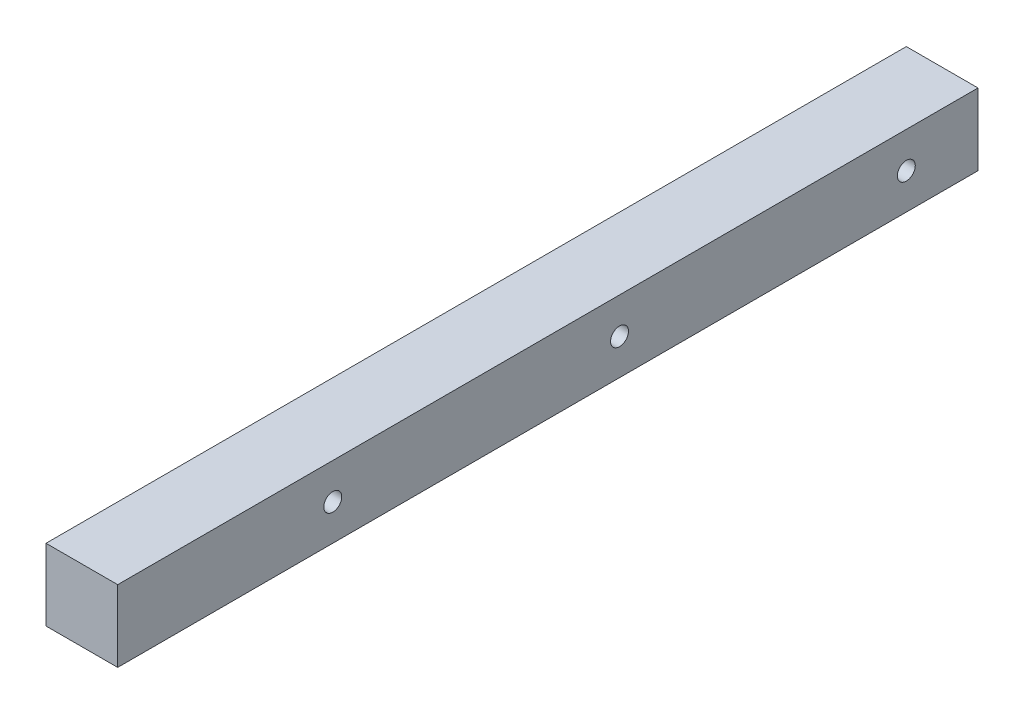
ISO-10303-21;
HEADER;
FILE_DESCRIPTION(('STEP AP214'),'2;1');
FILE_NAME('part.step','',(''),(''),'','','');
FILE_SCHEMA(('AUTOMOTIVE_DESIGN { 1 0 10303 214 1 1 1 1 }'));
ENDSEC;
DATA;
#1=APPLICATION_CONTEXT('core data for automotive mechanical design processes');
#2=APPLICATION_PROTOCOL_DEFINITION('international standard','automotive_design',2000,#1);
#3=PRODUCT_CONTEXT('',#1,'mechanical');
#4=PRODUCT('Part','Part','',(#3));
#5=PRODUCT_RELATED_PRODUCT_CATEGORY('part','',(#4));
#6=PRODUCT_DEFINITION_FORMATION('','',#4);
#7=PRODUCT_DEFINITION_CONTEXT('part definition',#1,'design');
#8=PRODUCT_DEFINITION('design','',#6,#7);
#9=PRODUCT_DEFINITION_SHAPE('','',#8);
#10=(LENGTH_UNIT() NAMED_UNIT(*) SI_UNIT(.MILLI.,.METRE.));
#11=(NAMED_UNIT(*) PLANE_ANGLE_UNIT() SI_UNIT($,.RADIAN.));
#12=(NAMED_UNIT(*) SI_UNIT($,.STERADIAN.) SOLID_ANGLE_UNIT());
#13=UNCERTAINTY_MEASURE_WITH_UNIT(LENGTH_MEASURE(1.E-05),#10,'distance_accuracy_value','');
#14=(GEOMETRIC_REPRESENTATION_CONTEXT(3) GLOBAL_UNCERTAINTY_ASSIGNED_CONTEXT((#13)) GLOBAL_UNIT_ASSIGNED_CONTEXT((#10,
#11,#12)) REPRESENTATION_CONTEXT('',''));
#15=CARTESIAN_POINT('',(0.,0.,0.));
#16=DIRECTION('',(0.,0.,1.));
#17=DIRECTION('',(1.,0.,0.));
#18=AXIS2_PLACEMENT_3D('',#15,#16,#17);
#19=CARTESIAN_POINT('',(12.7,-12.7,152.4));
#20=DIRECTION('',(-1.,0.,0.));
#21=DIRECTION('',(0.,0.,1.));
#22=AXIS2_PLACEMENT_3D('',#19,#20,#21);
#23=PLANE('',#22);
#24=CARTESIAN_POINT('',(12.7,0.,-127.));
#25=DIRECTION('',(-1.,0.,0.));
#26=DIRECTION('',(0.,0.,1.));
#27=AXIS2_PLACEMENT_3D('',#24,#25,#26);
#28=CIRCLE('',#27,3.175);
#29=CARTESIAN_POINT('',(12.7,0.,-123.825));
#30=VERTEX_POINT('',#29);
#31=EDGE_CURVE('E121',#30,#30,#28,.T.);
#32=ORIENTED_EDGE('',*,*,#31,.T.);
#33=EDGE_LOOP('',(#32));
#34=FACE_BOUND('',#33,.T.);
#35=CARTESIAN_POINT('',(12.7,0.,76.2));
#36=DIRECTION('',(-1.,0.,0.));
#37=DIRECTION('',(0.,0.,1.));
#38=AXIS2_PLACEMENT_3D('',#35,#36,#37);
#39=CIRCLE('',#38,3.175);
#40=CARTESIAN_POINT('',(12.7,0.,79.375));
#41=VERTEX_POINT('',#40);
#42=EDGE_CURVE('E124',#41,#41,#39,.T.);
#43=ORIENTED_EDGE('',*,*,#42,.T.);
#44=EDGE_LOOP('',(#43));
#45=FACE_BOUND('',#44,.T.);
#46=CARTESIAN_POINT('',(12.7,0.,-25.4));
#47=DIRECTION('',(-1.,0.,0.));
#48=DIRECTION('',(0.,0.,1.));
#49=AXIS2_PLACEMENT_3D('',#46,#47,#48);
#50=CIRCLE('',#49,3.175);
#51=CARTESIAN_POINT('',(12.7,0.,-22.225));
#52=VERTEX_POINT('',#51);
#53=EDGE_CURVE('E118',#52,#52,#50,.T.);
#54=ORIENTED_EDGE('',*,*,#53,.T.);
#55=EDGE_LOOP('',(#54));
#56=FACE_BOUND('',#55,.T.);
#57=DIRECTION('',(0.,1.,0.));
#58=VECTOR('',#57,1.);
#59=CARTESIAN_POINT('',(12.7,-12.7,-152.4));
#60=LINE('',#59,#58);
#61=CARTESIAN_POINT('',(12.7,-12.7,-152.4));
#62=VERTEX_POINT('',#61);
#63=CARTESIAN_POINT('',(12.7,12.7,-152.4));
#64=VERTEX_POINT('',#63);
#65=EDGE_CURVE('E104',#62,#64,#60,.T.);
#66=ORIENTED_EDGE('',*,*,#65,.T.);
#67=DIRECTION('',(0.,0.,-1.));
#68=VECTOR('',#67,1.);
#69=CARTESIAN_POINT('',(12.7,12.7,152.4));
#70=LINE('',#69,#68);
#71=CARTESIAN_POINT('',(12.7,12.7,152.4));
#72=VERTEX_POINT('',#71);
#73=EDGE_CURVE('E11',#72,#64,#70,.T.);
#74=ORIENTED_EDGE('',*,*,#73,.F.);
#75=DIRECTION('',(0.,1.,0.));
#76=VECTOR('',#75,1.);
#77=CARTESIAN_POINT('',(12.7,-12.7,152.4));
#78=LINE('',#77,#76);
#79=CARTESIAN_POINT('',(12.7,-12.7,152.4));
#80=VERTEX_POINT('',#79);
#81=EDGE_CURVE('E92',#80,#72,#78,.T.);
#82=ORIENTED_EDGE('',*,*,#81,.F.);
#83=DIRECTION('',(0.,0.,-1.));
#84=VECTOR('',#83,1.);
#85=CARTESIAN_POINT('',(12.7,-12.7,152.4));
#86=LINE('',#85,#84);
#87=EDGE_CURVE('E100',#80,#62,#86,.T.);
#88=ORIENTED_EDGE('',*,*,#87,.T.);
#89=EDGE_LOOP('',(#66,#74,#82,#88));
#90=FACE_BOUND('',#89,.T.);
#91=ADVANCED_FACE('F41',(#34,#45,#56,#90),#23,.F.);
#92=CARTESIAN_POINT('',(-12.7,12.7,152.4));
#93=DIRECTION('',(0.,-1.,0.));
#94=DIRECTION('',(0.,0.,-1.));
#95=AXIS2_PLACEMENT_3D('',#92,#93,#94);
#96=PLANE('',#95);
#97=DIRECTION('',(-1.,0.,0.));
#98=VECTOR('',#97,1.);
#99=CARTESIAN_POINT('',(-12.7,12.7,-152.4));
#100=LINE('',#99,#98);
#101=CARTESIAN_POINT('',(-12.7,12.7,-152.4));
#102=VERTEX_POINT('',#101);
#103=EDGE_CURVE('E96',#64,#102,#100,.T.);
#104=ORIENTED_EDGE('',*,*,#103,.T.);
#105=DIRECTION('',(0.,0.,-1.));
#106=VECTOR('',#105,1.);
#107=CARTESIAN_POINT('',(-12.7,12.7,152.4));
#108=LINE('',#107,#106);
#109=CARTESIAN_POINT('',(-12.7,12.7,152.4));
#110=VERTEX_POINT('',#109);
#111=EDGE_CURVE('E49',#110,#102,#108,.T.);
#112=ORIENTED_EDGE('',*,*,#111,.F.);
#113=DIRECTION('',(-1.,0.,0.));
#114=VECTOR('',#113,1.);
#115=CARTESIAN_POINT('',(-12.7,12.7,152.4));
#116=LINE('',#115,#114);
#117=EDGE_CURVE('E87',#72,#110,#116,.T.);
#118=ORIENTED_EDGE('',*,*,#117,.F.);
#119=ORIENTED_EDGE('',*,*,#73,.T.);
#120=EDGE_LOOP('',(#104,#112,#118,#119));
#121=FACE_BOUND('',#120,.T.);
#122=ADVANCED_FACE('F95',(#121),#96,.F.);
#123=CARTESIAN_POINT('',(-12.7,-12.7,152.4));
#124=DIRECTION('',(1.,0.,0.));
#125=DIRECTION('',(0.,0.,-1.));
#126=AXIS2_PLACEMENT_3D('',#123,#124,#125);
#127=PLANE('',#126);
#128=CARTESIAN_POINT('',(-12.7,0.,-127.));
#129=DIRECTION('',(-1.,0.,0.));
#130=DIRECTION('',(0.,0.,1.));
#131=AXIS2_PLACEMENT_3D('',#128,#129,#130);
#132=CIRCLE('',#131,3.175);
#133=CARTESIAN_POINT('',(-12.7,0.,-123.825));
#134=VERTEX_POINT('',#133);
#135=EDGE_CURVE('E127',#134,#134,#132,.T.);
#136=ORIENTED_EDGE('',*,*,#135,.F.);
#137=EDGE_LOOP('',(#136));
#138=FACE_BOUND('',#137,.T.);
#139=CARTESIAN_POINT('',(-12.7,0.,76.2));
#140=DIRECTION('',(-1.,0.,0.));
#141=DIRECTION('',(0.,0.,1.));
#142=AXIS2_PLACEMENT_3D('',#139,#140,#141);
#143=CIRCLE('',#142,3.175);
#144=CARTESIAN_POINT('',(-12.7,0.,79.375));
#145=VERTEX_POINT('',#144);
#146=EDGE_CURVE('E128',#145,#145,#143,.T.);
#147=ORIENTED_EDGE('',*,*,#146,.F.);
#148=EDGE_LOOP('',(#147));
#149=FACE_BOUND('',#148,.T.);
#150=CARTESIAN_POINT('',(-12.7,0.,-25.4));
#151=DIRECTION('',(-1.,0.,0.));
#152=DIRECTION('',(0.,0.,1.));
#153=AXIS2_PLACEMENT_3D('',#150,#151,#152);
#154=CIRCLE('',#153,3.175);
#155=CARTESIAN_POINT('',(-12.7,0.,-22.225));
#156=VERTEX_POINT('',#155);
#157=EDGE_CURVE('E107',#156,#156,#154,.T.);
#158=ORIENTED_EDGE('',*,*,#157,.F.);
#159=EDGE_LOOP('',(#158));
#160=FACE_BOUND('',#159,.T.);
#161=DIRECTION('',(0.,-1.,0.));
#162=VECTOR('',#161,1.);
#163=CARTESIAN_POINT('',(-12.7,-12.7,-152.4));
#164=LINE('',#163,#162);
#165=CARTESIAN_POINT('',(-12.7,-12.7,-152.4));
#166=VERTEX_POINT('',#165);
#167=EDGE_CURVE('E74',#102,#166,#164,.T.);
#168=ORIENTED_EDGE('',*,*,#167,.T.);
#169=DIRECTION('',(0.,0.,-1.));
#170=VECTOR('',#169,1.);
#171=CARTESIAN_POINT('',(-12.7,-12.7,152.4));
#172=LINE('',#171,#170);
#173=CARTESIAN_POINT('',(-12.7,-12.7,152.4));
#174=VERTEX_POINT('',#173);
#175=EDGE_CURVE('E97',#174,#166,#172,.T.);
#176=ORIENTED_EDGE('',*,*,#175,.F.);
#177=DIRECTION('',(0.,-1.,0.));
#178=VECTOR('',#177,1.);
#179=CARTESIAN_POINT('',(-12.7,-12.7,152.4));
#180=LINE('',#179,#178);
#181=EDGE_CURVE('E90',#110,#174,#180,.T.);
#182=ORIENTED_EDGE('',*,*,#181,.F.);
#183=ORIENTED_EDGE('',*,*,#111,.T.);
#184=EDGE_LOOP('',(#168,#176,#182,#183));
#185=FACE_BOUND('',#184,.T.);
#186=ADVANCED_FACE('F98',(#138,#149,#160,#185),#127,.F.);
#187=CARTESIAN_POINT('',(-12.7,-12.7,152.4));
#188=DIRECTION('',(0.,1.,0.));
#189=DIRECTION('',(0.,0.,1.));
#190=AXIS2_PLACEMENT_3D('',#187,#188,#189);
#191=PLANE('',#190);
#192=DIRECTION('',(1.,0.,0.));
#193=VECTOR('',#192,1.);
#194=CARTESIAN_POINT('',(-12.7,-12.7,-152.4));
#195=LINE('',#194,#193);
#196=EDGE_CURVE('E80',#166,#62,#195,.T.);
#197=ORIENTED_EDGE('',*,*,#196,.T.);
#198=ORIENTED_EDGE('',*,*,#87,.F.);
#199=DIRECTION('',(1.,0.,0.));
#200=VECTOR('',#199,1.);
#201=CARTESIAN_POINT('',(-12.7,-12.7,152.4));
#202=LINE('',#201,#200);
#203=EDGE_CURVE('E57',#174,#80,#202,.T.);
#204=ORIENTED_EDGE('',*,*,#203,.F.);
#205=ORIENTED_EDGE('',*,*,#175,.T.);
#206=EDGE_LOOP('',(#197,#198,#204,#205));
#207=FACE_BOUND('',#206,.T.);
#208=ADVANCED_FACE('F112',(#207),#191,.F.);
#209=CARTESIAN_POINT('',(0.,0.,152.4));
#210=DIRECTION('',(0.,0.,-1.));
#211=DIRECTION('',(-1.,0.,0.));
#212=AXIS2_PLACEMENT_3D('',#209,#210,#211);
#213=PLANE('',#212);
#214=ORIENTED_EDGE('',*,*,#81,.T.);
#215=ORIENTED_EDGE('',*,*,#117,.T.);
#216=ORIENTED_EDGE('',*,*,#181,.T.);
#217=ORIENTED_EDGE('',*,*,#203,.T.);
#218=EDGE_LOOP('',(#214,#215,#216,#217));
#219=FACE_BOUND('',#218,.T.);
#220=ADVANCED_FACE('F88',(#219),#213,.F.);
#221=CARTESIAN_POINT('',(0.,0.,-152.4));
#222=DIRECTION('',(0.,0.,-1.));
#223=DIRECTION('',(-1.,0.,0.));
#224=AXIS2_PLACEMENT_3D('',#221,#222,#223);
#225=PLANE('',#224);
#226=ORIENTED_EDGE('',*,*,#65,.F.);
#227=ORIENTED_EDGE('',*,*,#196,.F.);
#228=ORIENTED_EDGE('',*,*,#167,.F.);
#229=ORIENTED_EDGE('',*,*,#103,.F.);
#230=EDGE_LOOP('',(#226,#227,#228,#229));
#231=FACE_BOUND('',#230,.T.);
#232=ADVANCED_FACE('F115',(#231),#225,.T.);
#233=CARTESIAN_POINT('',(-12.7,0.,-25.4));
#234=DIRECTION('',(1.,0.,0.));
#235=DIRECTION('',(0.,0.,-1.));
#236=AXIS2_PLACEMENT_3D('',#233,#234,#235);
#237=CYLINDRICAL_SURFACE('',#236,3.175);
#238=ORIENTED_EDGE('',*,*,#157,.T.);
#239=EDGE_LOOP('',(#238));
#240=FACE_BOUND('',#239,.T.);
#241=ORIENTED_EDGE('',*,*,#53,.F.);
#242=EDGE_LOOP('',(#241));
#243=FACE_BOUND('',#242,.T.);
#244=ADVANCED_FACE('F146',(#240,#243),#237,.F.);
#245=CARTESIAN_POINT('',(-12.7,0.,76.2));
#246=DIRECTION('',(1.,0.,0.));
#247=DIRECTION('',(0.,0.,-1.));
#248=AXIS2_PLACEMENT_3D('',#245,#246,#247);
#249=CYLINDRICAL_SURFACE('',#248,3.175);
#250=ORIENTED_EDGE('',*,*,#146,.T.);
#251=EDGE_LOOP('',(#250));
#252=FACE_BOUND('',#251,.T.);
#253=ORIENTED_EDGE('',*,*,#42,.F.);
#254=EDGE_LOOP('',(#253));
#255=FACE_BOUND('',#254,.T.);
#256=ADVANCED_FACE('F149',(#252,#255),#249,.F.);
#257=CARTESIAN_POINT('',(-12.7,0.,-127.));
#258=DIRECTION('',(1.,0.,0.));
#259=DIRECTION('',(0.,0.,-1.));
#260=AXIS2_PLACEMENT_3D('',#257,#258,#259);
#261=CYLINDRICAL_SURFACE('',#260,3.175);
#262=ORIENTED_EDGE('',*,*,#135,.T.);
#263=EDGE_LOOP('',(#262));
#264=FACE_BOUND('',#263,.T.);
#265=ORIENTED_EDGE('',*,*,#31,.F.);
#266=EDGE_LOOP('',(#265));
#267=FACE_BOUND('',#266,.T.);
#268=ADVANCED_FACE('F136',(#264,#267),#261,.F.);
#269=CLOSED_SHELL('',(#91,#122,#186,#208,#220,#232,#244,#256,#268));
#270=MANIFOLD_SOLID_BREP('B2',#269);
#271=ADVANCED_BREP_SHAPE_REPRESENTATION('',(#18,#270),#14);
#272=SHAPE_DEFINITION_REPRESENTATION(#9,#271);
ENDSEC;
END-ISO-10303-21;
